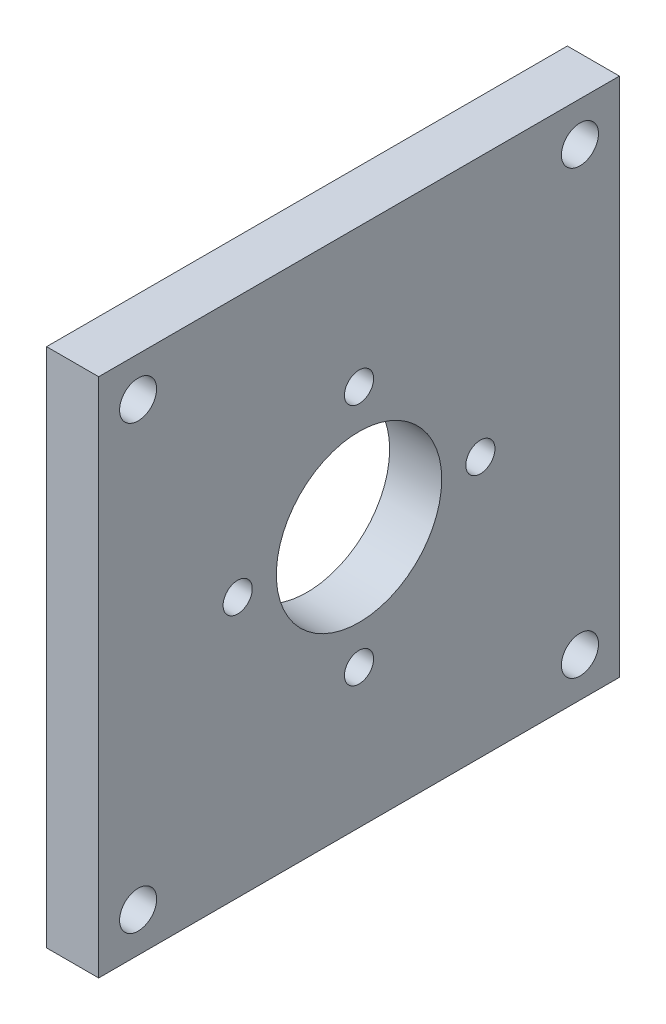
ISO-10303-21;
HEADER;
FILE_DESCRIPTION(('STEP AP214'),'2;1');
FILE_NAME('part.step','',(''),(''),'','','');
FILE_SCHEMA(('AUTOMOTIVE_DESIGN { 1 0 10303 214 1 1 1 1 }'));
ENDSEC;
DATA;
#1=APPLICATION_CONTEXT('core data for automotive mechanical design processes');
#2=APPLICATION_PROTOCOL_DEFINITION('international standard','automotive_design',2000,#1);
#3=PRODUCT_CONTEXT('',#1,'mechanical');
#4=PRODUCT('Part','Part','',(#3));
#5=PRODUCT_RELATED_PRODUCT_CATEGORY('part','',(#4));
#6=PRODUCT_DEFINITION_FORMATION('','',#4);
#7=PRODUCT_DEFINITION_CONTEXT('part definition',#1,'design');
#8=PRODUCT_DEFINITION('design','',#6,#7);
#9=PRODUCT_DEFINITION_SHAPE('','',#8);
#10=(LENGTH_UNIT() NAMED_UNIT(*) SI_UNIT(.MILLI.,.METRE.));
#11=(NAMED_UNIT(*) PLANE_ANGLE_UNIT() SI_UNIT($,.RADIAN.));
#12=(NAMED_UNIT(*) SI_UNIT($,.STERADIAN.) SOLID_ANGLE_UNIT());
#13=UNCERTAINTY_MEASURE_WITH_UNIT(LENGTH_MEASURE(1.E-05),#10,'distance_accuracy_value','');
#14=(GEOMETRIC_REPRESENTATION_CONTEXT(3) GLOBAL_UNCERTAINTY_ASSIGNED_CONTEXT((#13)) GLOBAL_UNIT_ASSIGNED_CONTEXT((#10,
#11,#12)) REPRESENTATION_CONTEXT('',''));
#15=CARTESIAN_POINT('',(0.,0.,0.));
#16=DIRECTION('',(0.,0.,1.));
#17=DIRECTION('',(1.,0.,0.));
#18=AXIS2_PLACEMENT_3D('',#15,#16,#17);
#19=CARTESIAN_POINT('',(3.175,0.,0.));
#20=DIRECTION('',(-1.,0.,0.));
#21=DIRECTION('',(0.,0.,1.));
#22=AXIS2_PLACEMENT_3D('',#19,#20,#21);
#23=PLANE('',#22);
#24=CARTESIAN_POINT('',(3.175,13.4703841816039,-13.4703841816036));
#25=DIRECTION('',(1.,0.,0.));
#26=DIRECTION('',(0.,0.,-1.));
#27=AXIS2_PLACEMENT_3D('',#24,#25,#26);
#28=CIRCLE('',#27,1.1303);
#29=CARTESIAN_POINT('',(3.175,13.4703841816039,-14.6006841816036));
#30=VERTEX_POINT('',#29);
#31=EDGE_CURVE('E218',#30,#30,#28,.T.);
#32=ORIENTED_EDGE('',*,*,#31,.F.);
#33=EDGE_LOOP('',(#32));
#34=FACE_BOUND('',#33,.T.);
#35=DIRECTION('',(0.,1.,0.));
#36=VECTOR('',#35,1.);
#37=CARTESIAN_POINT('',(3.175,-15.875,-15.875));
#38=LINE('',#37,#36);
#39=CARTESIAN_POINT('',(3.175,-15.875,-15.875));
#40=VERTEX_POINT('',#39);
#41=CARTESIAN_POINT('',(3.175,15.875,-15.875));
#42=VERTEX_POINT('',#41);
#43=EDGE_CURVE('E88',#40,#42,#38,.T.);
#44=ORIENTED_EDGE('',*,*,#43,.T.);
#45=DIRECTION('',(0.,0.,1.));
#46=VECTOR('',#45,1.);
#47=CARTESIAN_POINT('',(3.175,15.875,15.875));
#48=LINE('',#47,#46);
#49=CARTESIAN_POINT('',(3.175,15.875,15.875));
#50=VERTEX_POINT('',#49);
#51=EDGE_CURVE('E83',#42,#50,#48,.T.);
#52=ORIENTED_EDGE('',*,*,#51,.T.);
#53=DIRECTION('',(0.,-1.,0.));
#54=VECTOR('',#53,1.);
#55=CARTESIAN_POINT('',(3.175,-15.875,15.875));
#56=LINE('',#55,#54);
#57=CARTESIAN_POINT('',(3.175,-15.875,15.875));
#58=VERTEX_POINT('',#57);
#59=EDGE_CURVE('E86',#50,#58,#56,.T.);
#60=ORIENTED_EDGE('',*,*,#59,.T.);
#61=DIRECTION('',(0.,0.,-1.));
#62=VECTOR('',#61,1.);
#63=CARTESIAN_POINT('',(3.175,-15.875,15.875));
#64=LINE('',#63,#62);
#65=EDGE_CURVE('E53',#58,#40,#64,.T.);
#66=ORIENTED_EDGE('',*,*,#65,.T.);
#67=EDGE_LOOP('',(#44,#52,#60,#66));
#68=FACE_BOUND('',#67,.T.);
#69=CARTESIAN_POINT('',(3.175,0.,0.));
#70=DIRECTION('',(1.,0.,0.));
#71=DIRECTION('',(0.,0.,-1.));
#72=AXIS2_PLACEMENT_3D('',#69,#70,#71);
#73=CIRCLE('',#72,5.0419);
#74=CARTESIAN_POINT('',(3.175,0.,-5.0419));
#75=VERTEX_POINT('',#74);
#76=EDGE_CURVE('E148',#75,#75,#73,.T.);
#77=ORIENTED_EDGE('',*,*,#76,.F.);
#78=EDGE_LOOP('',(#77));
#79=FACE_BOUND('',#78,.T.);
#80=CARTESIAN_POINT('',(3.175,7.4,0.));
#81=DIRECTION('',(1.,0.,0.));
#82=DIRECTION('',(0.,0.,-1.));
#83=AXIS2_PLACEMENT_3D('',#80,#81,#82);
#84=CIRCLE('',#83,0.888999999999989);
#85=CARTESIAN_POINT('',(3.175,7.4,-0.888999999999989));
#86=VERTEX_POINT('',#85);
#87=EDGE_CURVE('E113',#86,#86,#84,.T.);
#88=ORIENTED_EDGE('',*,*,#87,.F.);
#89=EDGE_LOOP('',(#88));
#90=FACE_BOUND('',#89,.T.);
#91=CARTESIAN_POINT('',(3.175,0.,7.4));
#92=DIRECTION('',(1.,0.,0.));
#93=DIRECTION('',(0.,0.,-1.));
#94=AXIS2_PLACEMENT_3D('',#91,#92,#93);
#95=CIRCLE('',#94,0.888999999999989);
#96=CARTESIAN_POINT('',(3.175,0.,6.51100000000001));
#97=VERTEX_POINT('',#96);
#98=EDGE_CURVE('E114',#97,#97,#95,.T.);
#99=ORIENTED_EDGE('',*,*,#98,.F.);
#100=EDGE_LOOP('',(#99));
#101=FACE_BOUND('',#100,.T.);
#102=CARTESIAN_POINT('',(3.175,-7.4,0.));
#103=DIRECTION('',(1.,0.,0.));
#104=DIRECTION('',(0.,0.,-1.));
#105=AXIS2_PLACEMENT_3D('',#102,#103,#104);
#106=CIRCLE('',#105,0.888999999999989);
#107=CARTESIAN_POINT('',(3.175,-7.4,-0.888999999999989));
#108=VERTEX_POINT('',#107);
#109=EDGE_CURVE('E117',#108,#108,#106,.T.);
#110=ORIENTED_EDGE('',*,*,#109,.F.);
#111=EDGE_LOOP('',(#110));
#112=FACE_BOUND('',#111,.T.);
#113=CARTESIAN_POINT('',(3.175,0.,-7.4));
#114=DIRECTION('',(1.,0.,0.));
#115=DIRECTION('',(0.,0.,-1.));
#116=AXIS2_PLACEMENT_3D('',#113,#114,#115);
#117=CIRCLE('',#116,0.888999999999989);
#118=CARTESIAN_POINT('',(3.175,0.,-8.28899999999999));
#119=VERTEX_POINT('',#118);
#120=EDGE_CURVE('E120',#119,#119,#117,.T.);
#121=ORIENTED_EDGE('',*,*,#120,.F.);
#122=EDGE_LOOP('',(#121));
#123=FACE_BOUND('',#122,.T.);
#124=CARTESIAN_POINT('',(3.175,13.4703841816037,13.4703841816038));
#125=DIRECTION('',(1.,0.,0.));
#126=DIRECTION('',(0.,0.,-1.));
#127=AXIS2_PLACEMENT_3D('',#124,#125,#126);
#128=CIRCLE('',#127,1.1303);
#129=CARTESIAN_POINT('',(3.175,13.4703841816037,12.3400841816038));
#130=VERTEX_POINT('',#129);
#131=EDGE_CURVE('E121',#130,#130,#128,.T.);
#132=ORIENTED_EDGE('',*,*,#131,.F.);
#133=EDGE_LOOP('',(#132));
#134=FACE_BOUND('',#133,.T.);
#135=CARTESIAN_POINT('',(3.175,-13.4703841816038,13.4703841816037));
#136=DIRECTION('',(1.,0.,0.));
#137=DIRECTION('',(0.,0.,-1.));
#138=AXIS2_PLACEMENT_3D('',#135,#136,#137);
#139=CIRCLE('',#138,1.1303);
#140=CARTESIAN_POINT('',(3.175,-13.4703841816038,12.3400841816037));
#141=VERTEX_POINT('',#140);
#142=EDGE_CURVE('E133',#141,#141,#139,.T.);
#143=ORIENTED_EDGE('',*,*,#142,.F.);
#144=EDGE_LOOP('',(#143));
#145=FACE_BOUND('',#144,.T.);
#146=CARTESIAN_POINT('',(3.175,-13.4703841816037,-13.4703841816038));
#147=DIRECTION('',(1.,0.,0.));
#148=DIRECTION('',(0.,0.,-1.));
#149=AXIS2_PLACEMENT_3D('',#146,#147,#148);
#150=CIRCLE('',#149,1.1303);
#151=CARTESIAN_POINT('',(3.175,-13.4703841816037,-14.6006841816038));
#152=VERTEX_POINT('',#151);
#153=EDGE_CURVE('E220',#152,#152,#150,.T.);
#154=ORIENTED_EDGE('',*,*,#153,.F.);
#155=EDGE_LOOP('',(#154));
#156=FACE_BOUND('',#155,.T.);
#157=ADVANCED_FACE('F34',(#34,#68,#79,#90,#101,#112,#123,#134,#145,#156),#23,.F.);
#158=CARTESIAN_POINT('',(3.175,-15.875,-15.875));
#159=DIRECTION('',(0.,0.,1.));
#160=DIRECTION('',(1.,0.,0.));
#161=AXIS2_PLACEMENT_3D('',#158,#159,#160);
#162=PLANE('',#161);
#163=DIRECTION('',(0.,1.,0.));
#164=VECTOR('',#163,1.);
#165=CARTESIAN_POINT('',(0.,-15.875,-15.875));
#166=LINE('',#165,#164);
#167=CARTESIAN_POINT('',(0.,-15.875,-15.875));
#168=VERTEX_POINT('',#167);
#169=CARTESIAN_POINT('',(0.,15.875,-15.875));
#170=VERTEX_POINT('',#169);
#171=EDGE_CURVE('E101',#168,#170,#166,.T.);
#172=ORIENTED_EDGE('',*,*,#171,.T.);
#173=DIRECTION('',(-1.,0.,0.));
#174=VECTOR('',#173,1.);
#175=CARTESIAN_POINT('',(3.175,15.875,-15.875));
#176=LINE('',#175,#174);
#177=EDGE_CURVE('E11',#42,#170,#176,.T.);
#178=ORIENTED_EDGE('',*,*,#177,.F.);
#179=ORIENTED_EDGE('',*,*,#43,.F.);
#180=DIRECTION('',(-1.,0.,0.));
#181=VECTOR('',#180,1.);
#182=CARTESIAN_POINT('',(3.175,-15.875,-15.875));
#183=LINE('',#182,#181);
#184=EDGE_CURVE('E97',#40,#168,#183,.T.);
#185=ORIENTED_EDGE('',*,*,#184,.T.);
#186=EDGE_LOOP('',(#172,#178,#179,#185));
#187=FACE_BOUND('',#186,.T.);
#188=ADVANCED_FACE('F36',(#187),#162,.F.);
#189=CARTESIAN_POINT('',(3.175,15.875,15.875));
#190=DIRECTION('',(0.,-1.,0.));
#191=DIRECTION('',(0.,0.,-1.));
#192=AXIS2_PLACEMENT_3D('',#189,#190,#191);
#193=PLANE('',#192);
#194=DIRECTION('',(0.,0.,1.));
#195=VECTOR('',#194,1.);
#196=CARTESIAN_POINT('',(0.,15.875,15.875));
#197=LINE('',#196,#195);
#198=CARTESIAN_POINT('',(0.,15.875,15.875));
#199=VERTEX_POINT('',#198);
#200=EDGE_CURVE('E92',#170,#199,#197,.T.);
#201=ORIENTED_EDGE('',*,*,#200,.T.);
#202=DIRECTION('',(-1.,0.,0.));
#203=VECTOR('',#202,1.);
#204=CARTESIAN_POINT('',(3.175,15.875,15.875));
#205=LINE('',#204,#203);
#206=EDGE_CURVE('E44',#50,#199,#205,.T.);
#207=ORIENTED_EDGE('',*,*,#206,.F.);
#208=ORIENTED_EDGE('',*,*,#51,.F.);
#209=ORIENTED_EDGE('',*,*,#177,.T.);
#210=EDGE_LOOP('',(#201,#207,#208,#209));
#211=FACE_BOUND('',#210,.T.);
#212=ADVANCED_FACE('F91',(#211),#193,.F.);
#213=CARTESIAN_POINT('',(3.175,-15.875,15.875));
#214=DIRECTION('',(0.,0.,-1.));
#215=DIRECTION('',(-1.,0.,0.));
#216=AXIS2_PLACEMENT_3D('',#213,#214,#215);
#217=PLANE('',#216);
#218=DIRECTION('',(0.,-1.,0.));
#219=VECTOR('',#218,1.);
#220=CARTESIAN_POINT('',(0.,-15.875,15.875));
#221=LINE('',#220,#219);
#222=CARTESIAN_POINT('',(0.,-15.875,15.875));
#223=VERTEX_POINT('',#222);
#224=EDGE_CURVE('E70',#199,#223,#221,.T.);
#225=ORIENTED_EDGE('',*,*,#224,.T.);
#226=DIRECTION('',(-1.,0.,0.));
#227=VECTOR('',#226,1.);
#228=CARTESIAN_POINT('',(3.175,-15.875,15.875));
#229=LINE('',#228,#227);
#230=EDGE_CURVE('E93',#58,#223,#229,.T.);
#231=ORIENTED_EDGE('',*,*,#230,.F.);
#232=ORIENTED_EDGE('',*,*,#59,.F.);
#233=ORIENTED_EDGE('',*,*,#206,.T.);
#234=EDGE_LOOP('',(#225,#231,#232,#233));
#235=FACE_BOUND('',#234,.T.);
#236=ADVANCED_FACE('F95',(#235),#217,.F.);
#237=CARTESIAN_POINT('',(3.175,-15.875,15.875));
#238=DIRECTION('',(0.,1.,0.));
#239=DIRECTION('',(0.,0.,1.));
#240=AXIS2_PLACEMENT_3D('',#237,#238,#239);
#241=PLANE('',#240);
#242=DIRECTION('',(0.,0.,-1.));
#243=VECTOR('',#242,1.);
#244=CARTESIAN_POINT('',(0.,-15.875,15.875));
#245=LINE('',#244,#243);
#246=EDGE_CURVE('E76',#223,#168,#245,.T.);
#247=ORIENTED_EDGE('',*,*,#246,.T.);
#248=ORIENTED_EDGE('',*,*,#184,.F.);
#249=ORIENTED_EDGE('',*,*,#65,.F.);
#250=ORIENTED_EDGE('',*,*,#230,.T.);
#251=EDGE_LOOP('',(#247,#248,#249,#250));
#252=FACE_BOUND('',#251,.T.);
#253=ADVANCED_FACE('F160',(#252),#241,.F.);
#254=CARTESIAN_POINT('',(0.,0.,0.));
#255=DIRECTION('',(-1.,0.,0.));
#256=DIRECTION('',(0.,0.,1.));
#257=AXIS2_PLACEMENT_3D('',#254,#255,#256);
#258=PLANE('',#257);
#259=CARTESIAN_POINT('',(0.,13.4703841816039,-13.4703841816036));
#260=DIRECTION('',(-1.,0.,0.));
#261=DIRECTION('',(0.,0.,1.));
#262=AXIS2_PLACEMENT_3D('',#259,#260,#261);
#263=CIRCLE('',#262,1.1303);
#264=CARTESIAN_POINT('',(0.,13.4703841816039,-12.3400841816036));
#265=VERTEX_POINT('',#264);
#266=EDGE_CURVE('E216',#265,#265,#263,.T.);
#267=ORIENTED_EDGE('',*,*,#266,.F.);
#268=EDGE_LOOP('',(#267));
#269=FACE_BOUND('',#268,.T.);
#270=CARTESIAN_POINT('',(0.,-13.4703841816037,-13.4703841816038));
#271=DIRECTION('',(-1.,0.,0.));
#272=DIRECTION('',(0.,0.,1.));
#273=AXIS2_PLACEMENT_3D('',#270,#271,#272);
#274=CIRCLE('',#273,1.1303);
#275=CARTESIAN_POINT('',(0.,-13.4703841816037,-12.3400841816038));
#276=VERTEX_POINT('',#275);
#277=EDGE_CURVE('E38',#276,#276,#274,.T.);
#278=ORIENTED_EDGE('',*,*,#277,.F.);
#279=EDGE_LOOP('',(#278));
#280=FACE_BOUND('',#279,.T.);
#281=CARTESIAN_POINT('',(0.,-13.4703841816038,13.4703841816037));
#282=DIRECTION('',(-1.,0.,0.));
#283=DIRECTION('',(0.,0.,1.));
#284=AXIS2_PLACEMENT_3D('',#281,#282,#283);
#285=CIRCLE('',#284,1.1303);
#286=CARTESIAN_POINT('',(0.,-13.4703841816038,14.6006841816037));
#287=VERTEX_POINT('',#286);
#288=EDGE_CURVE('E128',#287,#287,#285,.T.);
#289=ORIENTED_EDGE('',*,*,#288,.F.);
#290=EDGE_LOOP('',(#289));
#291=FACE_BOUND('',#290,.T.);
#292=CARTESIAN_POINT('',(0.,13.4703841816037,13.4703841816038));
#293=DIRECTION('',(-1.,0.,0.));
#294=DIRECTION('',(0.,0.,1.));
#295=AXIS2_PLACEMENT_3D('',#292,#293,#294);
#296=CIRCLE('',#295,1.1303);
#297=CARTESIAN_POINT('',(0.,13.4703841816037,14.6006841816038));
#298=VERTEX_POINT('',#297);
#299=EDGE_CURVE('E118',#298,#298,#296,.T.);
#300=ORIENTED_EDGE('',*,*,#299,.F.);
#301=EDGE_LOOP('',(#300));
#302=FACE_BOUND('',#301,.T.);
#303=CARTESIAN_POINT('',(0.,0.,-7.4));
#304=DIRECTION('',(-1.,0.,0.));
#305=DIRECTION('',(0.,0.,1.));
#306=AXIS2_PLACEMENT_3D('',#303,#304,#305);
#307=CIRCLE('',#306,0.888999999999988);
#308=CARTESIAN_POINT('',(0.,0.,-6.51100000000001));
#309=VERTEX_POINT('',#308);
#310=EDGE_CURVE('E125',#309,#309,#307,.T.);
#311=ORIENTED_EDGE('',*,*,#310,.F.);
#312=EDGE_LOOP('',(#311));
#313=FACE_BOUND('',#312,.T.);
#314=CARTESIAN_POINT('',(0.,-7.4,0.));
#315=DIRECTION('',(-1.,0.,0.));
#316=DIRECTION('',(0.,0.,1.));
#317=AXIS2_PLACEMENT_3D('',#314,#315,#316);
#318=CIRCLE('',#317,0.888999999999988);
#319=CARTESIAN_POINT('',(0.,-7.4,0.888999999999988));
#320=VERTEX_POINT('',#319);
#321=EDGE_CURVE('E115',#320,#320,#318,.T.);
#322=ORIENTED_EDGE('',*,*,#321,.F.);
#323=EDGE_LOOP('',(#322));
#324=FACE_BOUND('',#323,.T.);
#325=CARTESIAN_POINT('',(0.,0.,7.4));
#326=DIRECTION('',(-1.,0.,0.));
#327=DIRECTION('',(0.,0.,1.));
#328=AXIS2_PLACEMENT_3D('',#325,#326,#327);
#329=CIRCLE('',#328,0.888999999999988);
#330=CARTESIAN_POINT('',(0.,0.,8.28899999999999));
#331=VERTEX_POINT('',#330);
#332=EDGE_CURVE('E110',#331,#331,#329,.T.);
#333=ORIENTED_EDGE('',*,*,#332,.F.);
#334=EDGE_LOOP('',(#333));
#335=FACE_BOUND('',#334,.T.);
#336=CARTESIAN_POINT('',(0.,7.4,0.));
#337=DIRECTION('',(-1.,0.,0.));
#338=DIRECTION('',(0.,0.,1.));
#339=AXIS2_PLACEMENT_3D('',#336,#337,#338);
#340=CIRCLE('',#339,0.888999999999988);
#341=CARTESIAN_POINT('',(0.,7.4,0.888999999999988));
#342=VERTEX_POINT('',#341);
#343=EDGE_CURVE('E145',#342,#342,#340,.T.);
#344=ORIENTED_EDGE('',*,*,#343,.F.);
#345=EDGE_LOOP('',(#344));
#346=FACE_BOUND('',#345,.T.);
#347=CARTESIAN_POINT('',(0.,0.,0.));
#348=DIRECTION('',(-1.,0.,0.));
#349=DIRECTION('',(0.,0.,1.));
#350=AXIS2_PLACEMENT_3D('',#347,#348,#349);
#351=CIRCLE('',#350,5.0419);
#352=CARTESIAN_POINT('',(0.,0.,5.0419));
#353=VERTEX_POINT('',#352);
#354=EDGE_CURVE('E104',#353,#353,#351,.T.);
#355=ORIENTED_EDGE('',*,*,#354,.F.);
#356=EDGE_LOOP('',(#355));
#357=FACE_BOUND('',#356,.T.);
#358=ORIENTED_EDGE('',*,*,#171,.F.);
#359=ORIENTED_EDGE('',*,*,#246,.F.);
#360=ORIENTED_EDGE('',*,*,#224,.F.);
#361=ORIENTED_EDGE('',*,*,#200,.F.);
#362=EDGE_LOOP('',(#358,#359,#360,#361));
#363=FACE_BOUND('',#362,.T.);
#364=ADVANCED_FACE('F157',(#269,#280,#291,#302,#313,#324,#335,#346,#357,#363),#258,.T.);
#365=CARTESIAN_POINT('',(3.175,0.,0.));
#366=DIRECTION('',(1.,0.,0.));
#367=DIRECTION('',(0.,0.,-1.));
#368=AXIS2_PLACEMENT_3D('',#365,#366,#367);
#369=CYLINDRICAL_SURFACE('',#368,5.0419);
#370=ORIENTED_EDGE('',*,*,#354,.T.);
#371=EDGE_LOOP('',(#370));
#372=FACE_BOUND('',#371,.T.);
#373=ORIENTED_EDGE('',*,*,#76,.T.);
#374=EDGE_LOOP('',(#373));
#375=FACE_BOUND('',#374,.T.);
#376=ADVANCED_FACE('F154',(#372,#375),#369,.F.);
#377=CARTESIAN_POINT('',(3.175,7.4,0.));
#378=DIRECTION('',(1.,0.,0.));
#379=DIRECTION('',(0.,0.,-1.));
#380=AXIS2_PLACEMENT_3D('',#377,#378,#379);
#381=CYLINDRICAL_SURFACE('',#380,0.888999999999988);
#382=ORIENTED_EDGE('',*,*,#343,.T.);
#383=EDGE_LOOP('',(#382));
#384=FACE_BOUND('',#383,.T.);
#385=ORIENTED_EDGE('',*,*,#87,.T.);
#386=EDGE_LOOP('',(#385));
#387=FACE_BOUND('',#386,.T.);
#388=ADVANCED_FACE('F181',(#384,#387),#381,.F.);
#389=CARTESIAN_POINT('',(3.175,0.,7.4));
#390=DIRECTION('',(1.,0.,0.));
#391=DIRECTION('',(0.,0.,-1.));
#392=AXIS2_PLACEMENT_3D('',#389,#390,#391);
#393=CYLINDRICAL_SURFACE('',#392,0.888999999999988);
#394=ORIENTED_EDGE('',*,*,#332,.T.);
#395=EDGE_LOOP('',(#394));
#396=FACE_BOUND('',#395,.T.);
#397=ORIENTED_EDGE('',*,*,#98,.T.);
#398=EDGE_LOOP('',(#397));
#399=FACE_BOUND('',#398,.T.);
#400=ADVANCED_FACE('F184',(#396,#399),#393,.F.);
#401=CARTESIAN_POINT('',(3.175,-7.4,0.));
#402=DIRECTION('',(1.,0.,0.));
#403=DIRECTION('',(0.,0.,-1.));
#404=AXIS2_PLACEMENT_3D('',#401,#402,#403);
#405=CYLINDRICAL_SURFACE('',#404,0.888999999999988);
#406=ORIENTED_EDGE('',*,*,#321,.T.);
#407=EDGE_LOOP('',(#406));
#408=FACE_BOUND('',#407,.T.);
#409=ORIENTED_EDGE('',*,*,#109,.T.);
#410=EDGE_LOOP('',(#409));
#411=FACE_BOUND('',#410,.T.);
#412=ADVANCED_FACE('F188',(#408,#411),#405,.F.);
#413=CARTESIAN_POINT('',(3.175,0.,-7.4));
#414=DIRECTION('',(1.,0.,0.));
#415=DIRECTION('',(0.,0.,-1.));
#416=AXIS2_PLACEMENT_3D('',#413,#414,#415);
#417=CYLINDRICAL_SURFACE('',#416,0.888999999999988);
#418=ORIENTED_EDGE('',*,*,#310,.T.);
#419=EDGE_LOOP('',(#418));
#420=FACE_BOUND('',#419,.T.);
#421=ORIENTED_EDGE('',*,*,#120,.T.);
#422=EDGE_LOOP('',(#421));
#423=FACE_BOUND('',#422,.T.);
#424=ADVANCED_FACE('F192',(#420,#423),#417,.F.);
#425=CARTESIAN_POINT('',(3.175,13.4703841816037,13.4703841816038));
#426=DIRECTION('',(1.,0.,0.));
#427=DIRECTION('',(0.,0.,-1.));
#428=AXIS2_PLACEMENT_3D('',#425,#426,#427);
#429=CYLINDRICAL_SURFACE('',#428,1.1303);
#430=ORIENTED_EDGE('',*,*,#299,.T.);
#431=EDGE_LOOP('',(#430));
#432=FACE_BOUND('',#431,.T.);
#433=ORIENTED_EDGE('',*,*,#131,.T.);
#434=EDGE_LOOP('',(#433));
#435=FACE_BOUND('',#434,.T.);
#436=ADVANCED_FACE('F196',(#432,#435),#429,.F.);
#437=CARTESIAN_POINT('',(3.175,-13.4703841816038,13.4703841816037));
#438=DIRECTION('',(1.,0.,0.));
#439=DIRECTION('',(0.,0.,-1.));
#440=AXIS2_PLACEMENT_3D('',#437,#438,#439);
#441=CYLINDRICAL_SURFACE('',#440,1.1303);
#442=ORIENTED_EDGE('',*,*,#288,.T.);
#443=EDGE_LOOP('',(#442));
#444=FACE_BOUND('',#443,.T.);
#445=ORIENTED_EDGE('',*,*,#142,.T.);
#446=EDGE_LOOP('',(#445));
#447=FACE_BOUND('',#446,.T.);
#448=ADVANCED_FACE('F200',(#444,#447),#441,.F.);
#449=CARTESIAN_POINT('',(3.175,-13.4703841816037,-13.4703841816038));
#450=DIRECTION('',(1.,0.,0.));
#451=DIRECTION('',(0.,0.,-1.));
#452=AXIS2_PLACEMENT_3D('',#449,#450,#451);
#453=CYLINDRICAL_SURFACE('',#452,1.1303);
#454=ORIENTED_EDGE('',*,*,#277,.T.);
#455=EDGE_LOOP('',(#454));
#456=FACE_BOUND('',#455,.T.);
#457=ORIENTED_EDGE('',*,*,#153,.T.);
#458=EDGE_LOOP('',(#457));
#459=FACE_BOUND('',#458,.T.);
#460=ADVANCED_FACE('F203',(#456,#459),#453,.F.);
#461=CARTESIAN_POINT('',(3.175,13.4703841816039,-13.4703841816036));
#462=DIRECTION('',(1.,0.,0.));
#463=DIRECTION('',(0.,0.,-1.));
#464=AXIS2_PLACEMENT_3D('',#461,#462,#463);
#465=CYLINDRICAL_SURFACE('',#464,1.1303);
#466=ORIENTED_EDGE('',*,*,#266,.T.);
#467=EDGE_LOOP('',(#466));
#468=FACE_BOUND('',#467,.T.);
#469=ORIENTED_EDGE('',*,*,#31,.T.);
#470=EDGE_LOOP('',(#469));
#471=FACE_BOUND('',#470,.T.);
#472=ADVANCED_FACE('F207',(#468,#471),#465,.F.);
#473=CLOSED_SHELL('',(#157,#188,#212,#236,#253,#364,#376,#388,#400,#412,#424,#436,#448,#460,#472));
#474=MANIFOLD_SOLID_BREP('B2',#473);
#475=ADVANCED_BREP_SHAPE_REPRESENTATION('',(#18,#474),#14);
#476=SHAPE_DEFINITION_REPRESENTATION(#9,#475);
ENDSEC;
END-ISO-10303-21;
